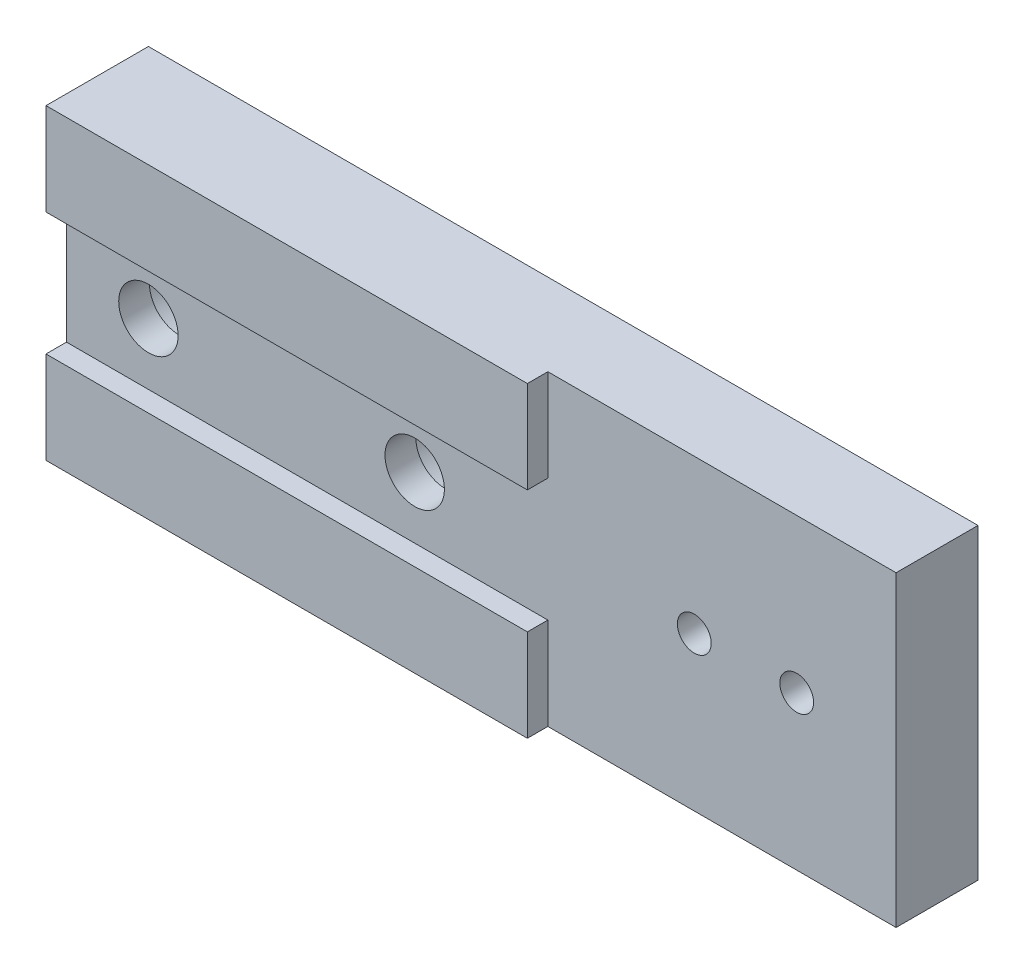
ISO-10303-21;
HEADER;
FILE_DESCRIPTION(('STEP AP214'),'2;1');
FILE_NAME('part.step','',(''),(''),'','','');
FILE_SCHEMA(('AUTOMOTIVE_DESIGN { 1 0 10303 214 1 1 1 1 }'));
ENDSEC;
DATA;
#1=APPLICATION_CONTEXT('core data for automotive mechanical design processes');
#2=APPLICATION_PROTOCOL_DEFINITION('international standard','automotive_design',2000,#1);
#3=PRODUCT_CONTEXT('',#1,'mechanical');
#4=PRODUCT('Part','Part','',(#3));
#5=PRODUCT_RELATED_PRODUCT_CATEGORY('part','',(#4));
#6=PRODUCT_DEFINITION_FORMATION('','',#4);
#7=PRODUCT_DEFINITION_CONTEXT('part definition',#1,'design');
#8=PRODUCT_DEFINITION('design','',#6,#7);
#9=PRODUCT_DEFINITION_SHAPE('','',#8);
#10=(LENGTH_UNIT() NAMED_UNIT(*) SI_UNIT(.MILLI.,.METRE.));
#11=(NAMED_UNIT(*) PLANE_ANGLE_UNIT() SI_UNIT($,.RADIAN.));
#12=(NAMED_UNIT(*) SI_UNIT($,.STERADIAN.) SOLID_ANGLE_UNIT());
#13=UNCERTAINTY_MEASURE_WITH_UNIT(LENGTH_MEASURE(1.E-05),#10,'distance_accuracy_value','');
#14=(GEOMETRIC_REPRESENTATION_CONTEXT(3) GLOBAL_UNCERTAINTY_ASSIGNED_CONTEXT((#13)) GLOBAL_UNIT_ASSIGNED_CONTEXT((#10,
#11,#12)) REPRESENTATION_CONTEXT('',''));
#15=CARTESIAN_POINT('',(0.,0.,0.));
#16=DIRECTION('',(0.,0.,1.));
#17=DIRECTION('',(1.,0.,0.));
#18=AXIS2_PLACEMENT_3D('',#15,#16,#17);
#19=CARTESIAN_POINT('',(0.,30.,10.));
#20=DIRECTION('',(0.,0.,-1.));
#21=DIRECTION('',(-1.,0.,0.));
#22=AXIS2_PLACEMENT_3D('',#19,#20,#21);
#23=PLANE('',#22);
#24=DIRECTION('',(-1.,0.,0.));
#25=VECTOR('',#24,1.);
#26=CARTESIAN_POINT('',(0.,21.,10.));
#27=LINE('',#26,#25);
#28=CARTESIAN_POINT('',(47.,21.,10.));
#29=VERTEX_POINT('',#28);
#30=CARTESIAN_POINT('',(0.,21.,10.));
#31=VERTEX_POINT('',#30);
#32=EDGE_CURVE('E180',#29,#31,#27,.T.);
#33=ORIENTED_EDGE('',*,*,#32,.F.);
#34=DIRECTION('',(0.,-1.,0.));
#35=VECTOR('',#34,1.);
#36=CARTESIAN_POINT('',(47.,30.,10.));
#37=LINE('',#36,#35);
#38=CARTESIAN_POINT('',(47.,30.,10.));
#39=VERTEX_POINT('',#38);
#40=EDGE_CURVE('E50',#39,#29,#37,.T.);
#41=ORIENTED_EDGE('',*,*,#40,.F.);
#42=DIRECTION('',(-1.,0.,0.));
#43=VECTOR('',#42,1.);
#44=CARTESIAN_POINT('',(0.,30.,10.));
#45=LINE('',#44,#43);
#46=CARTESIAN_POINT('',(0.,30.,10.));
#47=VERTEX_POINT('',#46);
#48=EDGE_CURVE('E134',#39,#47,#45,.T.);
#49=ORIENTED_EDGE('',*,*,#48,.T.);
#50=DIRECTION('',(0.,-1.,0.));
#51=VECTOR('',#50,1.);
#52=CARTESIAN_POINT('',(0.,0.,10.));
#53=LINE('',#52,#51);
#54=EDGE_CURVE('E135',#47,#31,#53,.T.);
#55=ORIENTED_EDGE('',*,*,#54,.T.);
#56=EDGE_LOOP('',(#33,#41,#49,#55));
#57=FACE_BOUND('',#56,.T.);
#58=ADVANCED_FACE('F35',(#57),#23,.F.);
#59=CARTESIAN_POINT('',(8.,15.,0.));
#60=DIRECTION('',(0.,0.,-1.));
#61=DIRECTION('',(-1.,0.,0.));
#62=AXIS2_PLACEMENT_3D('',#59,#60,#61);
#63=CYLINDRICAL_SURFACE('',#62,2.9);
#64=CARTESIAN_POINT('',(8.,15.,5.));
#65=DIRECTION('',(0.,0.,-1.));
#66=DIRECTION('',(-1.,0.,0.));
#67=AXIS2_PLACEMENT_3D('',#64,#65,#66);
#68=CIRCLE('',#67,2.90000000000001);
#69=CARTESIAN_POINT('',(5.09999999999999,15.,5.));
#70=VERTEX_POINT('',#69);
#71=EDGE_CURVE('E147',#70,#70,#68,.T.);
#72=ORIENTED_EDGE('',*,*,#71,.T.);
#73=EDGE_LOOP('',(#72));
#74=FACE_BOUND('',#73,.T.);
#75=CARTESIAN_POINT('',(8.,15.,8.));
#76=DIRECTION('',(0.,0.,1.));
#77=DIRECTION('',(1.,0.,0.));
#78=AXIS2_PLACEMENT_3D('',#75,#76,#77);
#79=CIRCLE('',#78,2.9);
#80=CARTESIAN_POINT('',(10.9,15.,8.));
#81=VERTEX_POINT('',#80);
#82=EDGE_CURVE('E163',#81,#81,#79,.F.);
#83=ORIENTED_EDGE('',*,*,#82,.F.);
#84=EDGE_LOOP('',(#83));
#85=FACE_BOUND('',#84,.T.);
#86=ADVANCED_FACE('F199',(#74,#85),#63,.F.);
#87=CARTESIAN_POINT('',(34.,15.,0.));
#88=DIRECTION('',(0.,0.,-1.));
#89=DIRECTION('',(-1.,0.,0.));
#90=AXIS2_PLACEMENT_3D('',#87,#88,#89);
#91=CYLINDRICAL_SURFACE('',#90,2.90000000000001);
#92=CARTESIAN_POINT('',(34.,15.,5.));
#93=DIRECTION('',(0.,0.,-1.));
#94=DIRECTION('',(-1.,0.,0.));
#95=AXIS2_PLACEMENT_3D('',#92,#93,#94);
#96=CIRCLE('',#95,2.90000000000001);
#97=CARTESIAN_POINT('',(31.1,15.,5.));
#98=VERTEX_POINT('',#97);
#99=EDGE_CURVE('E188',#98,#98,#96,.T.);
#100=ORIENTED_EDGE('',*,*,#99,.T.);
#101=EDGE_LOOP('',(#100));
#102=FACE_BOUND('',#101,.T.);
#103=CARTESIAN_POINT('',(34.,15.,8.));
#104=DIRECTION('',(0.,0.,1.));
#105=DIRECTION('',(1.,0.,0.));
#106=AXIS2_PLACEMENT_3D('',#103,#104,#105);
#107=CIRCLE('',#106,2.90000000000001);
#108=CARTESIAN_POINT('',(36.9,15.,8.));
#109=VERTEX_POINT('',#108);
#110=EDGE_CURVE('E161',#109,#109,#107,.F.);
#111=ORIENTED_EDGE('',*,*,#110,.F.);
#112=EDGE_LOOP('',(#111));
#113=FACE_BOUND('',#112,.T.);
#114=ADVANCED_FACE('F266',(#102,#113),#91,.F.);
#115=CARTESIAN_POINT('',(0.,0.,10.));
#116=DIRECTION('',(1.,0.,0.));
#117=DIRECTION('',(0.,0.,-1.));
#118=AXIS2_PLACEMENT_3D('',#115,#116,#117);
#119=PLANE('',#118);
#120=DIRECTION('',(0.,-1.,0.));
#121=VECTOR('',#120,1.);
#122=CARTESIAN_POINT('',(0.,21.,8.));
#123=LINE('',#122,#121);
#124=CARTESIAN_POINT('',(0.,21.,8.));
#125=VERTEX_POINT('',#124);
#126=CARTESIAN_POINT('',(0.,9.,8.));
#127=VERTEX_POINT('',#126);
#128=EDGE_CURVE('E251',#125,#127,#123,.T.);
#129=ORIENTED_EDGE('',*,*,#128,.F.);
#130=DIRECTION('',(0.,0.,1.));
#131=VECTOR('',#130,1.);
#132=CARTESIAN_POINT('',(0.,21.,8.));
#133=LINE('',#132,#131);
#134=EDGE_CURVE('E164',#125,#31,#133,.T.);
#135=ORIENTED_EDGE('',*,*,#134,.T.);
#136=ORIENTED_EDGE('',*,*,#54,.F.);
#137=DIRECTION('',(0.,0.,-1.));
#138=VECTOR('',#137,1.);
#139=CARTESIAN_POINT('',(0.,30.,10.));
#140=LINE('',#139,#138);
#141=CARTESIAN_POINT('',(0.,30.,0.));
#142=VERTEX_POINT('',#141);
#143=EDGE_CURVE('E137',#47,#142,#140,.T.);
#144=ORIENTED_EDGE('',*,*,#143,.T.);
#145=DIRECTION('',(0.,-1.,0.));
#146=VECTOR('',#145,1.);
#147=CARTESIAN_POINT('',(0.,0.,0.));
#148=LINE('',#147,#146);
#149=CARTESIAN_POINT('',(0.,0.,0.));
#150=VERTEX_POINT('',#149);
#151=EDGE_CURVE('E143',#142,#150,#148,.T.);
#152=ORIENTED_EDGE('',*,*,#151,.T.);
#153=DIRECTION('',(0.,0.,-1.));
#154=VECTOR('',#153,1.);
#155=CARTESIAN_POINT('',(0.,0.,10.));
#156=LINE('',#155,#154);
#157=CARTESIAN_POINT('',(0.,0.,10.));
#158=VERTEX_POINT('',#157);
#159=EDGE_CURVE('E43',#158,#150,#156,.T.);
#160=ORIENTED_EDGE('',*,*,#159,.F.);
#161=CARTESIAN_POINT('',(0.,8.99999999999999,10.));
#162=VERTEX_POINT('',#161);
#163=EDGE_CURVE('E133',#162,#158,#53,.T.);
#164=ORIENTED_EDGE('',*,*,#163,.F.);
#165=DIRECTION('',(0.,0.,1.));
#166=VECTOR('',#165,1.);
#167=CARTESIAN_POINT('',(0.,9.,8.));
#168=LINE('',#167,#166);
#169=EDGE_CURVE('E171',#127,#162,#168,.T.);
#170=ORIENTED_EDGE('',*,*,#169,.F.);
#171=EDGE_LOOP('',(#129,#135,#136,#144,#152,#160,#164,#170));
#172=FACE_BOUND('',#171,.T.);
#173=ADVANCED_FACE('F37',(#172),#119,.F.);
#174=CARTESIAN_POINT('',(0.,0.,10.));
#175=DIRECTION('',(0.,1.,0.));
#176=DIRECTION('',(0.,0.,1.));
#177=AXIS2_PLACEMENT_3D('',#174,#175,#176);
#178=PLANE('',#177);
#179=DIRECTION('',(0.,0.,-1.));
#180=VECTOR('',#179,1.);
#181=CARTESIAN_POINT('',(81.,0.,10.));
#182=LINE('',#181,#180);
#183=CARTESIAN_POINT('',(81.,0.,8.));
#184=VERTEX_POINT('',#183);
#185=CARTESIAN_POINT('',(81.,0.,0.));
#186=VERTEX_POINT('',#185);
#187=EDGE_CURVE('E159',#184,#186,#182,.T.);
#188=ORIENTED_EDGE('',*,*,#187,.F.);
#189=DIRECTION('',(1.,0.,0.));
#190=VECTOR('',#189,1.);
#191=CARTESIAN_POINT('',(81.,0.,8.));
#192=LINE('',#191,#190);
#193=CARTESIAN_POINT('',(47.,0.,8.));
#194=VERTEX_POINT('',#193);
#195=EDGE_CURVE('E128',#194,#184,#192,.T.);
#196=ORIENTED_EDGE('',*,*,#195,.F.);
#197=DIRECTION('',(0.,0.,-1.));
#198=VECTOR('',#197,1.);
#199=CARTESIAN_POINT('',(47.,0.,10.));
#200=LINE('',#199,#198);
#201=CARTESIAN_POINT('',(47.,0.,10.));
#202=VERTEX_POINT('',#201);
#203=EDGE_CURVE('E112',#202,#194,#200,.T.);
#204=ORIENTED_EDGE('',*,*,#203,.F.);
#205=DIRECTION('',(1.,0.,0.));
#206=VECTOR('',#205,1.);
#207=CARTESIAN_POINT('',(0.,0.,10.));
#208=LINE('',#207,#206);
#209=EDGE_CURVE('E125',#158,#202,#208,.T.);
#210=ORIENTED_EDGE('',*,*,#209,.F.);
#211=ORIENTED_EDGE('',*,*,#159,.T.);
#212=DIRECTION('',(1.,0.,0.));
#213=VECTOR('',#212,1.);
#214=CARTESIAN_POINT('',(0.,0.,0.));
#215=LINE('',#214,#213);
#216=EDGE_CURVE('E146',#150,#186,#215,.T.);
#217=ORIENTED_EDGE('',*,*,#216,.T.);
#218=EDGE_LOOP('',(#188,#196,#204,#210,#211,#217));
#219=FACE_BOUND('',#218,.T.);
#220=ADVANCED_FACE('F123',(#219),#178,.F.);
#221=CARTESIAN_POINT('',(81.,0.,10.));
#222=DIRECTION('',(-1.,0.,0.));
#223=DIRECTION('',(0.,0.,1.));
#224=AXIS2_PLACEMENT_3D('',#221,#222,#223);
#225=PLANE('',#224);
#226=DIRECTION('',(0.,0.,-1.));
#227=VECTOR('',#226,1.);
#228=CARTESIAN_POINT('',(81.,30.,10.));
#229=LINE('',#228,#227);
#230=CARTESIAN_POINT('',(81.,30.,8.));
#231=VERTEX_POINT('',#230);
#232=CARTESIAN_POINT('',(81.,30.,0.));
#233=VERTEX_POINT('',#232);
#234=EDGE_CURVE('E157',#231,#233,#229,.T.);
#235=ORIENTED_EDGE('',*,*,#234,.F.);
#236=DIRECTION('',(0.,1.,0.));
#237=VECTOR('',#236,1.);
#238=CARTESIAN_POINT('',(81.,21.,8.));
#239=LINE('',#238,#237);
#240=EDGE_CURVE('E233',#184,#231,#239,.T.);
#241=ORIENTED_EDGE('',*,*,#240,.F.);
#242=ORIENTED_EDGE('',*,*,#187,.T.);
#243=DIRECTION('',(0.,1.,0.));
#244=VECTOR('',#243,1.);
#245=CARTESIAN_POINT('',(81.,0.,0.));
#246=LINE('',#245,#244);
#247=EDGE_CURVE('E150',#186,#233,#246,.T.);
#248=ORIENTED_EDGE('',*,*,#247,.T.);
#249=EDGE_LOOP('',(#235,#241,#242,#248));
#250=FACE_BOUND('',#249,.T.);
#251=ADVANCED_FACE('F232',(#250),#225,.F.);
#252=CARTESIAN_POINT('',(0.,30.,10.));
#253=DIRECTION('',(0.,-1.,0.));
#254=DIRECTION('',(0.,0.,-1.));
#255=AXIS2_PLACEMENT_3D('',#252,#253,#254);
#256=PLANE('',#255);
#257=DIRECTION('',(0.,0.,-1.));
#258=VECTOR('',#257,1.);
#259=CARTESIAN_POINT('',(47.,30.,10.));
#260=LINE('',#259,#258);
#261=CARTESIAN_POINT('',(47.,30.,8.));
#262=VERTEX_POINT('',#261);
#263=EDGE_CURVE('E239',#39,#262,#260,.T.);
#264=ORIENTED_EDGE('',*,*,#263,.T.);
#265=DIRECTION('',(1.,0.,0.));
#266=VECTOR('',#265,1.);
#267=CARTESIAN_POINT('',(81.,30.,8.));
#268=LINE('',#267,#266);
#269=EDGE_CURVE('E118',#262,#231,#268,.T.);
#270=ORIENTED_EDGE('',*,*,#269,.T.);
#271=ORIENTED_EDGE('',*,*,#234,.T.);
#272=DIRECTION('',(-1.,0.,0.));
#273=VECTOR('',#272,1.);
#274=CARTESIAN_POINT('',(0.,30.,0.));
#275=LINE('',#274,#273);
#276=EDGE_CURVE('E153',#233,#142,#275,.T.);
#277=ORIENTED_EDGE('',*,*,#276,.T.);
#278=ORIENTED_EDGE('',*,*,#143,.F.);
#279=ORIENTED_EDGE('',*,*,#48,.F.);
#280=EDGE_LOOP('',(#264,#270,#271,#277,#278,#279));
#281=FACE_BOUND('',#280,.T.);
#282=ADVANCED_FACE('F227',(#281),#256,.F.);
#283=ORIENTED_EDGE('',*,*,#209,.T.);
#284=CARTESIAN_POINT('',(47.,9.,10.));
#285=VERTEX_POINT('',#284);
#286=EDGE_CURVE('E109',#285,#202,#37,.T.);
#287=ORIENTED_EDGE('',*,*,#286,.F.);
#288=DIRECTION('',(1.,0.,0.));
#289=VECTOR('',#288,1.);
#290=CARTESIAN_POINT('',(0.,9.,10.));
#291=LINE('',#290,#289);
#292=EDGE_CURVE('E250',#162,#285,#291,.T.);
#293=ORIENTED_EDGE('',*,*,#292,.F.);
#294=ORIENTED_EDGE('',*,*,#163,.T.);
#295=EDGE_LOOP('',(#283,#287,#293,#294));
#296=FACE_BOUND('',#295,.T.);
#297=ADVANCED_FACE('F131',(#296),#23,.F.);
#298=CARTESIAN_POINT('',(0.,30.,0.));
#299=DIRECTION('',(0.,0.,-1.));
#300=DIRECTION('',(-1.,0.,0.));
#301=AXIS2_PLACEMENT_3D('',#298,#299,#300);
#302=PLANE('',#301);
#303=CARTESIAN_POINT('',(71.3,15.,0.));
#304=DIRECTION('',(0.,0.,1.));
#305=DIRECTION('',(1.,0.,0.));
#306=AXIS2_PLACEMENT_3D('',#303,#304,#305);
#307=CIRCLE('',#306,1.65);
#308=CARTESIAN_POINT('',(72.95,15.,0.));
#309=VERTEX_POINT('',#308);
#310=EDGE_CURVE('E321',#309,#309,#307,.T.);
#311=ORIENTED_EDGE('',*,*,#310,.T.);
#312=EDGE_LOOP('',(#311));
#313=FACE_BOUND('',#312,.T.);
#314=CARTESIAN_POINT('',(61.3,15.,0.));
#315=DIRECTION('',(0.,0.,1.));
#316=DIRECTION('',(1.,0.,0.));
#317=AXIS2_PLACEMENT_3D('',#314,#315,#316);
#318=CIRCLE('',#317,1.64999999999999);
#319=CARTESIAN_POINT('',(62.95,15.,0.));
#320=VERTEX_POINT('',#319);
#321=EDGE_CURVE('E129',#320,#320,#318,.T.);
#322=ORIENTED_EDGE('',*,*,#321,.T.);
#323=EDGE_LOOP('',(#322));
#324=FACE_BOUND('',#323,.T.);
#325=CARTESIAN_POINT('',(34.,15.,0.));
#326=DIRECTION('',(0.,0.,-1.));
#327=DIRECTION('',(-1.,0.,0.));
#328=AXIS2_PLACEMENT_3D('',#325,#326,#327);
#329=CIRCLE('',#328,4.99999999999999);
#330=CARTESIAN_POINT('',(29.,15.,0.));
#331=VERTEX_POINT('',#330);
#332=EDGE_CURVE('E168',#331,#331,#329,.T.);
#333=ORIENTED_EDGE('',*,*,#332,.F.);
#334=EDGE_LOOP('',(#333));
#335=FACE_BOUND('',#334,.T.);
#336=CARTESIAN_POINT('',(8.,15.,0.));
#337=DIRECTION('',(0.,0.,-1.));
#338=DIRECTION('',(-1.,0.,0.));
#339=AXIS2_PLACEMENT_3D('',#336,#337,#338);
#340=CIRCLE('',#339,4.99999999999999);
#341=CARTESIAN_POINT('',(3.00000000000001,15.,0.));
#342=VERTEX_POINT('',#341);
#343=EDGE_CURVE('E191',#342,#342,#340,.T.);
#344=ORIENTED_EDGE('',*,*,#343,.F.);
#345=EDGE_LOOP('',(#344));
#346=FACE_BOUND('',#345,.T.);
#347=ORIENTED_EDGE('',*,*,#151,.F.);
#348=ORIENTED_EDGE('',*,*,#276,.F.);
#349=ORIENTED_EDGE('',*,*,#247,.F.);
#350=ORIENTED_EDGE('',*,*,#216,.F.);
#351=EDGE_LOOP('',(#347,#348,#349,#350));
#352=FACE_BOUND('',#351,.T.);
#353=ADVANCED_FACE('F206',(#313,#324,#335,#346,#352),#302,.T.);
#354=CARTESIAN_POINT('',(10.9,15.,5.));
#355=DIRECTION('',(0.,0.,1.));
#356=DIRECTION('',(1.,0.,0.));
#357=AXIS2_PLACEMENT_3D('',#354,#355,#356);
#358=PLANE('',#357);
#359=ORIENTED_EDGE('',*,*,#71,.F.);
#360=EDGE_LOOP('',(#359));
#361=FACE_BOUND('',#360,.T.);
#362=CARTESIAN_POINT('',(8.,15.,5.));
#363=DIRECTION('',(0.,0.,-1.));
#364=DIRECTION('',(-1.,0.,0.));
#365=AXIS2_PLACEMENT_3D('',#362,#363,#364);
#366=CIRCLE('',#365,4.99999999999999);
#367=CARTESIAN_POINT('',(3.00000000000001,15.,5.));
#368=VERTEX_POINT('',#367);
#369=EDGE_CURVE('E194',#368,#368,#366,.T.);
#370=ORIENTED_EDGE('',*,*,#369,.T.);
#371=EDGE_LOOP('',(#370));
#372=FACE_BOUND('',#371,.T.);
#373=ADVANCED_FACE('F202',(#361,#372),#358,.F.);
#374=CARTESIAN_POINT('',(8.,15.,0.));
#375=DIRECTION('',(0.,0.,-1.));
#376=DIRECTION('',(-1.,0.,0.));
#377=AXIS2_PLACEMENT_3D('',#374,#375,#376);
#378=CYLINDRICAL_SURFACE('',#377,4.99999999999999);
#379=ORIENTED_EDGE('',*,*,#369,.F.);
#380=EDGE_LOOP('',(#379));
#381=FACE_BOUND('',#380,.T.);
#382=ORIENTED_EDGE('',*,*,#343,.T.);
#383=EDGE_LOOP('',(#382));
#384=FACE_BOUND('',#383,.T.);
#385=ADVANCED_FACE('F205',(#381,#384),#378,.F.);
#386=CARTESIAN_POINT('',(36.9,15.,5.));
#387=DIRECTION('',(0.,0.,1.));
#388=DIRECTION('',(1.,0.,0.));
#389=AXIS2_PLACEMENT_3D('',#386,#387,#388);
#390=PLANE('',#389);
#391=ORIENTED_EDGE('',*,*,#99,.F.);
#392=EDGE_LOOP('',(#391));
#393=FACE_BOUND('',#392,.T.);
#394=CARTESIAN_POINT('',(34.,15.,5.));
#395=DIRECTION('',(0.,0.,-1.));
#396=DIRECTION('',(-1.,0.,0.));
#397=AXIS2_PLACEMENT_3D('',#394,#395,#396);
#398=CIRCLE('',#397,4.99999999999999);
#399=CARTESIAN_POINT('',(29.,15.,5.));
#400=VERTEX_POINT('',#399);
#401=EDGE_CURVE('E185',#400,#400,#398,.T.);
#402=ORIENTED_EDGE('',*,*,#401,.T.);
#403=EDGE_LOOP('',(#402));
#404=FACE_BOUND('',#403,.T.);
#405=ADVANCED_FACE('F212',(#393,#404),#390,.F.);
#406=CARTESIAN_POINT('',(34.,15.,0.));
#407=DIRECTION('',(0.,0.,-1.));
#408=DIRECTION('',(-1.,0.,0.));
#409=AXIS2_PLACEMENT_3D('',#406,#407,#408);
#410=CYLINDRICAL_SURFACE('',#409,4.99999999999999);
#411=ORIENTED_EDGE('',*,*,#401,.F.);
#412=EDGE_LOOP('',(#411));
#413=FACE_BOUND('',#412,.T.);
#414=ORIENTED_EDGE('',*,*,#332,.T.);
#415=EDGE_LOOP('',(#414));
#416=FACE_BOUND('',#415,.T.);
#417=ADVANCED_FACE('F293',(#413,#416),#410,.F.);
#418=CARTESIAN_POINT('',(0.,9.,8.));
#419=DIRECTION('',(0.,0.,1.));
#420=DIRECTION('',(1.,0.,0.));
#421=AXIS2_PLACEMENT_3D('',#418,#419,#420);
#422=PLANE('',#421);
#423=CARTESIAN_POINT('',(71.3,15.,8.));
#424=DIRECTION('',(0.,0.,1.));
#425=DIRECTION('',(1.,0.,0.));
#426=AXIS2_PLACEMENT_3D('',#423,#424,#425);
#427=CIRCLE('',#426,1.64999999999998);
#428=CARTESIAN_POINT('',(72.95,15.,8.));
#429=VERTEX_POINT('',#428);
#430=EDGE_CURVE('E324',#429,#429,#427,.T.);
#431=ORIENTED_EDGE('',*,*,#430,.F.);
#432=EDGE_LOOP('',(#431));
#433=FACE_BOUND('',#432,.T.);
#434=CARTESIAN_POINT('',(61.3,15.,8.));
#435=DIRECTION('',(0.,0.,1.));
#436=DIRECTION('',(1.,0.,0.));
#437=AXIS2_PLACEMENT_3D('',#434,#435,#436);
#438=CIRCLE('',#437,1.64999999999999);
#439=CARTESIAN_POINT('',(62.95,15.,8.));
#440=VERTEX_POINT('',#439);
#441=EDGE_CURVE('E326',#440,#440,#438,.T.);
#442=ORIENTED_EDGE('',*,*,#441,.F.);
#443=EDGE_LOOP('',(#442));
#444=FACE_BOUND('',#443,.T.);
#445=DIRECTION('',(1.,0.,0.));
#446=VECTOR('',#445,1.);
#447=CARTESIAN_POINT('',(0.,9.,8.));
#448=LINE('',#447,#446);
#449=CARTESIAN_POINT('',(47.,9.,8.));
#450=VERTEX_POINT('',#449);
#451=EDGE_CURVE('E235',#127,#450,#448,.T.);
#452=ORIENTED_EDGE('',*,*,#451,.T.);
#453=DIRECTION('',(0.,-1.,0.));
#454=VECTOR('',#453,1.);
#455=CARTESIAN_POINT('',(47.,30.,8.));
#456=LINE('',#455,#454);
#457=EDGE_CURVE('E58',#450,#194,#456,.T.);
#458=ORIENTED_EDGE('',*,*,#457,.T.);
#459=ORIENTED_EDGE('',*,*,#195,.T.);
#460=ORIENTED_EDGE('',*,*,#240,.T.);
#461=ORIENTED_EDGE('',*,*,#269,.F.);
#462=CARTESIAN_POINT('',(47.,21.,8.));
#463=VERTEX_POINT('',#462);
#464=EDGE_CURVE('E245',#262,#463,#456,.T.);
#465=ORIENTED_EDGE('',*,*,#464,.T.);
#466=DIRECTION('',(-1.,0.,0.));
#467=VECTOR('',#466,1.);
#468=CARTESIAN_POINT('',(0.,21.,8.));
#469=LINE('',#468,#467);
#470=EDGE_CURVE('E177',#463,#125,#469,.T.);
#471=ORIENTED_EDGE('',*,*,#470,.T.);
#472=ORIENTED_EDGE('',*,*,#128,.T.);
#473=EDGE_LOOP('',(#452,#458,#459,#460,#461,#465,#471,#472));
#474=FACE_BOUND('',#473,.T.);
#475=ORIENTED_EDGE('',*,*,#110,.T.);
#476=EDGE_LOOP('',(#475));
#477=FACE_BOUND('',#476,.T.);
#478=ORIENTED_EDGE('',*,*,#82,.T.);
#479=EDGE_LOOP('',(#478));
#480=FACE_BOUND('',#479,.T.);
#481=ADVANCED_FACE('F238',(#433,#444,#474,#477,#480),#422,.T.);
#482=CARTESIAN_POINT('',(0.,21.,8.));
#483=DIRECTION('',(0.,1.,0.));
#484=DIRECTION('',(-1.,0.,0.));
#485=AXIS2_PLACEMENT_3D('',#482,#483,#484);
#486=PLANE('',#485);
#487=ORIENTED_EDGE('',*,*,#470,.F.);
#488=DIRECTION('',(0.,0.,1.));
#489=VECTOR('',#488,1.);
#490=CARTESIAN_POINT('',(47.,21.,8.));
#491=LINE('',#490,#489);
#492=EDGE_CURVE('E247',#463,#29,#491,.T.);
#493=ORIENTED_EDGE('',*,*,#492,.T.);
#494=ORIENTED_EDGE('',*,*,#32,.T.);
#495=ORIENTED_EDGE('',*,*,#134,.F.);
#496=EDGE_LOOP('',(#487,#493,#494,#495));
#497=FACE_BOUND('',#496,.T.);
#498=ADVANCED_FACE('F259',(#497),#486,.F.);
#499=CARTESIAN_POINT('',(0.,9.,8.));
#500=DIRECTION('',(0.,-1.,0.));
#501=DIRECTION('',(0.,0.,-1.));
#502=AXIS2_PLACEMENT_3D('',#499,#500,#501);
#503=PLANE('',#502);
#504=ORIENTED_EDGE('',*,*,#292,.T.);
#505=DIRECTION('',(0.,0.,-1.));
#506=VECTOR('',#505,1.);
#507=CARTESIAN_POINT('',(47.,9.,8.));
#508=LINE('',#507,#506);
#509=EDGE_CURVE('E11',#285,#450,#508,.T.);
#510=ORIENTED_EDGE('',*,*,#509,.T.);
#511=ORIENTED_EDGE('',*,*,#451,.F.);
#512=ORIENTED_EDGE('',*,*,#169,.T.);
#513=EDGE_LOOP('',(#504,#510,#511,#512));
#514=FACE_BOUND('',#513,.T.);
#515=ADVANCED_FACE('F298',(#514),#503,.F.);
#516=CARTESIAN_POINT('',(47.,30.,10.));
#517=DIRECTION('',(-1.,0.,0.));
#518=DIRECTION('',(0.,-1.,0.));
#519=AXIS2_PLACEMENT_3D('',#516,#517,#518);
#520=PLANE('',#519);
#521=ORIENTED_EDGE('',*,*,#286,.T.);
#522=ORIENTED_EDGE('',*,*,#203,.T.);
#523=ORIENTED_EDGE('',*,*,#457,.F.);
#524=ORIENTED_EDGE('',*,*,#509,.F.);
#525=EDGE_LOOP('',(#521,#522,#523,#524));
#526=FACE_BOUND('',#525,.T.);
#527=ADVANCED_FACE('F111',(#526),#520,.F.);
#528=ORIENTED_EDGE('',*,*,#464,.F.);
#529=ORIENTED_EDGE('',*,*,#263,.F.);
#530=ORIENTED_EDGE('',*,*,#40,.T.);
#531=ORIENTED_EDGE('',*,*,#492,.F.);
#532=EDGE_LOOP('',(#528,#529,#530,#531));
#533=FACE_BOUND('',#532,.T.);
#534=ADVANCED_FACE('F306',(#533),#520,.F.);
#535=CARTESIAN_POINT('',(61.3,15.,8.));
#536=DIRECTION('',(0.,0.,1.));
#537=DIRECTION('',(1.,0.,0.));
#538=AXIS2_PLACEMENT_3D('',#535,#536,#537);
#539=CYLINDRICAL_SURFACE('',#538,1.64999999999999);
#540=ORIENTED_EDGE('',*,*,#321,.F.);
#541=EDGE_LOOP('',(#540));
#542=FACE_BOUND('',#541,.T.);
#543=ORIENTED_EDGE('',*,*,#441,.T.);
#544=EDGE_LOOP('',(#543));
#545=FACE_BOUND('',#544,.T.);
#546=ADVANCED_FACE('F309',(#542,#545),#539,.F.);
#547=CARTESIAN_POINT('',(71.3,15.,8.));
#548=DIRECTION('',(0.,0.,1.));
#549=DIRECTION('',(1.,0.,0.));
#550=AXIS2_PLACEMENT_3D('',#547,#548,#549);
#551=CYLINDRICAL_SURFACE('',#550,1.64999999999999);
#552=ORIENTED_EDGE('',*,*,#310,.F.);
#553=EDGE_LOOP('',(#552));
#554=FACE_BOUND('',#553,.T.);
#555=ORIENTED_EDGE('',*,*,#430,.T.);
#556=EDGE_LOOP('',(#555));
#557=FACE_BOUND('',#556,.T.);
#558=ADVANCED_FACE('F312',(#554,#557),#551,.F.);
#559=CLOSED_SHELL('',(#58,#86,#114,#173,#220,#251,#282,#297,#353,#373,#385,#405,#417,#481,#498,
#515,#527,#534,#546,#558));
#560=MANIFOLD_SOLID_BREP('B2',#559);
#561=ADVANCED_BREP_SHAPE_REPRESENTATION('',(#18,#560),#14);
#562=SHAPE_DEFINITION_REPRESENTATION(#9,#561);
ENDSEC;
END-ISO-10303-21;
